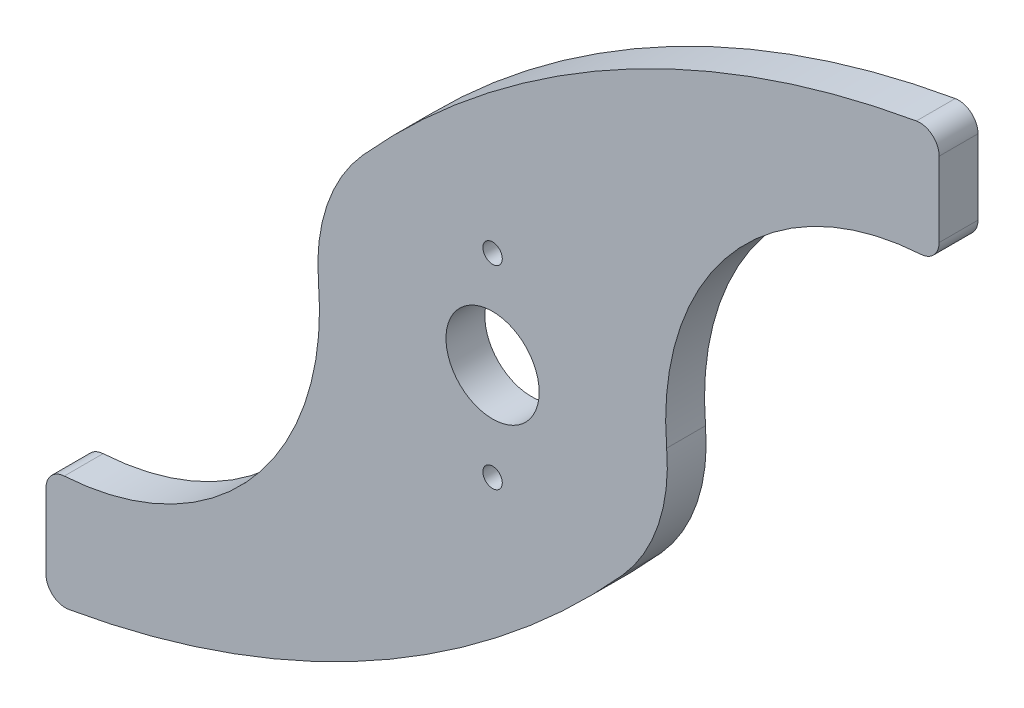
ISO-10303-21;
HEADER;
FILE_DESCRIPTION(('STEP AP214'),'2;1');
FILE_NAME('part.step','',(''),(''),'','','');
FILE_SCHEMA(('AUTOMOTIVE_DESIGN { 1 0 10303 214 1 1 1 1 }'));
ENDSEC;
DATA;
#1=APPLICATION_CONTEXT('core data for automotive mechanical design processes');
#2=APPLICATION_PROTOCOL_DEFINITION('international standard','automotive_design',2000,#1);
#3=PRODUCT_CONTEXT('',#1,'mechanical');
#4=PRODUCT('Part','Part','',(#3));
#5=PRODUCT_RELATED_PRODUCT_CATEGORY('part','',(#4));
#6=PRODUCT_DEFINITION_FORMATION('','',#4);
#7=PRODUCT_DEFINITION_CONTEXT('part definition',#1,'design');
#8=PRODUCT_DEFINITION('design','',#6,#7);
#9=PRODUCT_DEFINITION_SHAPE('','',#8);
#10=(LENGTH_UNIT() NAMED_UNIT(*) SI_UNIT(.MILLI.,.METRE.));
#11=(NAMED_UNIT(*) PLANE_ANGLE_UNIT() SI_UNIT($,.RADIAN.));
#12=(NAMED_UNIT(*) SI_UNIT($,.STERADIAN.) SOLID_ANGLE_UNIT());
#13=UNCERTAINTY_MEASURE_WITH_UNIT(LENGTH_MEASURE(1.E-05),#10,'distance_accuracy_value','');
#14=(GEOMETRIC_REPRESENTATION_CONTEXT(3) GLOBAL_UNCERTAINTY_ASSIGNED_CONTEXT((#13)) GLOBAL_UNIT_ASSIGNED_CONTEXT((#10,
#11,#12)) REPRESENTATION_CONTEXT('',''));
#15=CARTESIAN_POINT('',(0.,0.,0.));
#16=DIRECTION('',(0.,0.,1.));
#17=DIRECTION('',(1.,0.,0.));
#18=AXIS2_PLACEMENT_3D('',#15,#16,#17);
#19=CARTESIAN_POINT('',(0.,0.,10.));
#20=DIRECTION('',(0.,0.,-1.));
#21=DIRECTION('',(-1.,0.,0.));
#22=AXIS2_PLACEMENT_3D('',#19,#20,#21);
#23=CYLINDRICAL_SURFACE('',#22,45.);
#24=DIRECTION('',(0.,0.,1.));
#25=VECTOR('',#24,1.);
#26=CARTESIAN_POINT('',(33.436200173614,-30.1167813344989,0.));
#27=LINE('',#26,#25);
#28=CARTESIAN_POINT('',(33.436200173614,-30.1167813344989,0.));
#29=VERTEX_POINT('',#28);
#30=CARTESIAN_POINT('',(33.436200173614,-30.1167813344988,10.));
#31=VERTEX_POINT('',#30);
#32=EDGE_CURVE('E172',#29,#31,#27,.T.);
#33=ORIENTED_EDGE('',*,*,#32,.F.);
#34=CARTESIAN_POINT('',(0.,0.,0.));
#35=DIRECTION('',(0.,0.,1.));
#36=DIRECTION('',(1.,0.,0.));
#37=AXIS2_PLACEMENT_3D('',#34,#35,#36);
#38=CIRCLE('',#37,45.);
#39=CARTESIAN_POINT('',(44.8294985188369,3.91357414004155,0.));
#40=VERTEX_POINT('',#39);
#41=EDGE_CURVE('E157',#29,#40,#38,.T.);
#42=ORIENTED_EDGE('',*,*,#41,.T.);
#43=DIRECTION('',(0.,0.,1.));
#44=VECTOR('',#43,1.);
#45=CARTESIAN_POINT('',(44.8294985188369,3.91357414004155,0.));
#46=LINE('',#45,#44);
#47=CARTESIAN_POINT('',(44.8294985188369,3.91357414004155,10.));
#48=VERTEX_POINT('',#47);
#49=EDGE_CURVE('E204',#40,#48,#46,.T.);
#50=ORIENTED_EDGE('',*,*,#49,.T.);
#51=CARTESIAN_POINT('',(0.,0.,10.));
#52=DIRECTION('',(0.,0.,1.));
#53=DIRECTION('',(1.,0.,0.));
#54=AXIS2_PLACEMENT_3D('',#51,#52,#53);
#55=CIRCLE('',#54,45.);
#56=EDGE_CURVE('E174',#31,#48,#55,.T.);
#57=ORIENTED_EDGE('',*,*,#56,.F.);
#58=EDGE_LOOP('',(#33,#42,#50,#57));
#59=FACE_BOUND('',#58,.T.);
#60=ADVANCED_FACE('F69',(#59),#23,.T.);
#61=CARTESIAN_POINT('',(0.,0.,10.));
#62=DIRECTION('',(0.,0.,1.));
#63=DIRECTION('',(1.,0.,0.));
#64=AXIS2_PLACEMENT_3D('',#61,#62,#63);
#65=PLANE('',#64);
#66=CARTESIAN_POINT('',(0.,25.,10.));
#67=DIRECTION('',(0.,0.,1.));
#68=DIRECTION('',(1.,0.,0.));
#69=AXIS2_PLACEMENT_3D('',#66,#67,#68);
#70=CIRCLE('',#69,2.5);
#71=CARTESIAN_POINT('',(2.5,25.,10.));
#72=VERTEX_POINT('',#71);
#73=EDGE_CURVE('E298',#72,#72,#70,.T.);
#74=ORIENTED_EDGE('',*,*,#73,.F.);
#75=EDGE_LOOP('',(#74));
#76=FACE_BOUND('',#75,.T.);
#77=CARTESIAN_POINT('',(0.,-25.,10.));
#78=DIRECTION('',(0.,0.,1.));
#79=DIRECTION('',(1.,0.,0.));
#80=AXIS2_PLACEMENT_3D('',#77,#78,#79);
#81=CIRCLE('',#80,2.5);
#82=CARTESIAN_POINT('',(2.5,-25.,10.));
#83=VERTEX_POINT('',#82);
#84=EDGE_CURVE('E295',#83,#83,#81,.T.);
#85=ORIENTED_EDGE('',*,*,#84,.F.);
#86=EDGE_LOOP('',(#85));
#87=FACE_BOUND('',#86,.T.);
#88=DIRECTION('',(0.,1.,0.));
#89=VECTOR('',#88,1.);
#90=CARTESIAN_POINT('',(-115.,0.,10.));
#91=LINE('',#90,#89);
#92=CARTESIAN_POINT('',(-115.,-104.118502578652,10.));
#93=VERTEX_POINT('',#92);
#94=CARTESIAN_POINT('',(-115.,-84.8623433247219,10.));
#95=VERTEX_POINT('',#94);
#96=EDGE_CURVE('E191',#93,#95,#91,.T.);
#97=ORIENTED_EDGE('',*,*,#96,.F.);
#98=CARTESIAN_POINT('',(-110.,-104.118502578652,10.));
#99=DIRECTION('',(0.,0.,1.));
#100=DIRECTION('',(1.,0.,0.));
#101=AXIS2_PLACEMENT_3D('',#98,#99,#100);
#102=CIRCLE('',#101,5.);
#103=CARTESIAN_POINT('',(-109.136316990662,-109.04334284605,10.));
#104=VERTEX_POINT('',#103);
#105=EDGE_CURVE('E236',#93,#104,#102,.T.);
#106=ORIENTED_EDGE('',*,*,#105,.T.);
#107=CARTESIAN_POINT('',(-152.320467457575,137.198670523828,10.));
#108=DIRECTION('',(0.,0.,1.));
#109=DIRECTION('',(1.,0.,0.));
#110=AXIS2_PLACEMENT_3D('',#107,#108,#109);
#111=CIRCLE('',#110,250.);
#112=EDGE_CURVE('E195',#31,#104,#111,.F.);
#113=ORIENTED_EDGE('',*,*,#112,.F.);
#114=ORIENTED_EDGE('',*,*,#56,.T.);
#115=CARTESIAN_POINT('',(114.564273992583,10.0013561356617,10.));
#116=DIRECTION('',(0.,0.,1.));
#117=DIRECTION('',(1.,0.,0.));
#118=AXIS2_PLACEMENT_3D('',#115,#116,#117);
#119=CIRCLE('',#118,70.);
#120=CARTESIAN_POINT('',(110.304284932839,79.8716108454512,10.));
#121=VERTEX_POINT('',#120);
#122=EDGE_CURVE('E192',#121,#48,#119,.T.);
#123=ORIENTED_EDGE('',*,*,#122,.F.);
#124=CARTESIAN_POINT('',(110.,84.8623433247219,10.));
#125=DIRECTION('',(0.,0.,1.));
#126=DIRECTION('',(1.,0.,0.));
#127=AXIS2_PLACEMENT_3D('',#124,#125,#126);
#128=CIRCLE('',#127,5.);
#129=CARTESIAN_POINT('',(115.,84.8623433247219,10.));
#130=VERTEX_POINT('',#129);
#131=EDGE_CURVE('E232',#121,#130,#128,.T.);
#132=ORIENTED_EDGE('',*,*,#131,.T.);
#133=DIRECTION('',(0.,-1.,0.));
#134=VECTOR('',#133,1.);
#135=CARTESIAN_POINT('',(115.,0.,10.));
#136=LINE('',#135,#134);
#137=CARTESIAN_POINT('',(115.,104.118502578652,10.));
#138=VERTEX_POINT('',#137);
#139=EDGE_CURVE('E210',#138,#130,#136,.T.);
#140=ORIENTED_EDGE('',*,*,#139,.F.);
#141=CARTESIAN_POINT('',(110.,104.118502578652,10.));
#142=DIRECTION('',(0.,0.,1.));
#143=DIRECTION('',(1.,0.,0.));
#144=AXIS2_PLACEMENT_3D('',#141,#142,#143);
#145=CIRCLE('',#144,5.);
#146=CARTESIAN_POINT('',(109.136316990662,109.04334284605,10.));
#147=VERTEX_POINT('',#146);
#148=EDGE_CURVE('E230',#138,#147,#145,.T.);
#149=ORIENTED_EDGE('',*,*,#148,.T.);
#150=CARTESIAN_POINT('',(152.320467457575,-137.198670523828,10.));
#151=DIRECTION('',(0.,0.,1.));
#152=DIRECTION('',(1.,0.,0.));
#153=AXIS2_PLACEMENT_3D('',#150,#151,#152);
#154=CIRCLE('',#153,250.);
#155=CARTESIAN_POINT('',(-33.436200173614,30.1167813344988,10.));
#156=VERTEX_POINT('',#155);
#157=EDGE_CURVE('E207',#156,#147,#154,.F.);
#158=ORIENTED_EDGE('',*,*,#157,.F.);
#159=CARTESIAN_POINT('',(-44.8294985188369,-3.91357414004156,10.));
#160=VERTEX_POINT('',#159);
#161=EDGE_CURVE('E223',#156,#160,#55,.T.);
#162=ORIENTED_EDGE('',*,*,#161,.T.);
#163=CARTESIAN_POINT('',(-114.564273992583,-10.0013561356617,10.));
#164=DIRECTION('',(0.,0.,1.));
#165=DIRECTION('',(1.,0.,0.));
#166=AXIS2_PLACEMENT_3D('',#163,#164,#165);
#167=CIRCLE('',#166,70.);
#168=CARTESIAN_POINT('',(-110.304284932839,-79.8716108454512,10.));
#169=VERTEX_POINT('',#168);
#170=EDGE_CURVE('E189',#169,#160,#167,.T.);
#171=ORIENTED_EDGE('',*,*,#170,.F.);
#172=CARTESIAN_POINT('',(-110.,-84.8623433247219,10.));
#173=DIRECTION('',(0.,0.,1.));
#174=DIRECTION('',(1.,0.,0.));
#175=AXIS2_PLACEMENT_3D('',#172,#173,#174);
#176=CIRCLE('',#175,5.);
#177=EDGE_CURVE('E234',#169,#95,#176,.T.);
#178=ORIENTED_EDGE('',*,*,#177,.T.);
#179=EDGE_LOOP('',(#97,#106,#113,#114,#123,#132,#140,#149,#158,#162,#171,#178));
#180=FACE_BOUND('',#179,.T.);
#181=CARTESIAN_POINT('',(0.,0.,10.));
#182=DIRECTION('',(0.,0.,1.));
#183=DIRECTION('',(1.,0.,0.));
#184=AXIS2_PLACEMENT_3D('',#181,#182,#183);
#185=CIRCLE('',#184,12.);
#186=CARTESIAN_POINT('',(12.,0.,10.));
#187=VERTEX_POINT('',#186);
#188=EDGE_CURVE('E169',#187,#187,#185,.T.);
#189=ORIENTED_EDGE('',*,*,#188,.F.);
#190=EDGE_LOOP('',(#189));
#191=FACE_BOUND('',#190,.T.);
#192=ADVANCED_FACE('F268',(#76,#87,#180,#191),#65,.T.);
#193=CARTESIAN_POINT('',(0.,0.,0.));
#194=DIRECTION('',(0.,0.,1.));
#195=DIRECTION('',(1.,0.,0.));
#196=AXIS2_PLACEMENT_3D('',#193,#194,#195);
#197=PLANE('',#196);
#198=CARTESIAN_POINT('',(0.,25.,0.));
#199=DIRECTION('',(0.,0.,1.));
#200=DIRECTION('',(1.,0.,0.));
#201=AXIS2_PLACEMENT_3D('',#198,#199,#200);
#202=CIRCLE('',#201,2.5);
#203=CARTESIAN_POINT('',(2.5,25.,0.));
#204=VERTEX_POINT('',#203);
#205=EDGE_CURVE('E206',#204,#204,#202,.T.);
#206=ORIENTED_EDGE('',*,*,#205,.T.);
#207=EDGE_LOOP('',(#206));
#208=FACE_BOUND('',#207,.T.);
#209=CARTESIAN_POINT('',(0.,-25.,0.));
#210=DIRECTION('',(0.,0.,1.));
#211=DIRECTION('',(1.,0.,0.));
#212=AXIS2_PLACEMENT_3D('',#209,#210,#211);
#213=CIRCLE('',#212,2.5);
#214=CARTESIAN_POINT('',(2.5,-25.,0.));
#215=VERTEX_POINT('',#214);
#216=EDGE_CURVE('E292',#215,#215,#213,.T.);
#217=ORIENTED_EDGE('',*,*,#216,.T.);
#218=EDGE_LOOP('',(#217));
#219=FACE_BOUND('',#218,.T.);
#220=CARTESIAN_POINT('',(-152.320467457575,137.198670523828,0.));
#221=DIRECTION('',(0.,0.,1.));
#222=DIRECTION('',(1.,0.,0.));
#223=AXIS2_PLACEMENT_3D('',#220,#221,#222);
#224=CIRCLE('',#223,250.);
#225=CARTESIAN_POINT('',(-109.136316990662,-109.04334284605,0.));
#226=VERTEX_POINT('',#225);
#227=EDGE_CURVE('E162',#29,#226,#224,.F.);
#228=ORIENTED_EDGE('',*,*,#227,.T.);
#229=CARTESIAN_POINT('',(-110.,-104.118502578652,0.));
#230=DIRECTION('',(0.,0.,1.));
#231=DIRECTION('',(1.,0.,0.));
#232=AXIS2_PLACEMENT_3D('',#229,#230,#231);
#233=CIRCLE('',#232,5.);
#234=CARTESIAN_POINT('',(-115.,-104.118502578652,0.));
#235=VERTEX_POINT('',#234);
#236=EDGE_CURVE('E243',#226,#235,#233,.F.);
#237=ORIENTED_EDGE('',*,*,#236,.T.);
#238=DIRECTION('',(0.,1.,0.));
#239=VECTOR('',#238,1.);
#240=CARTESIAN_POINT('',(-115.,0.,0.));
#241=LINE('',#240,#239);
#242=CARTESIAN_POINT('',(-115.,-84.8623433247219,0.));
#243=VERTEX_POINT('',#242);
#244=EDGE_CURVE('E183',#235,#243,#241,.T.);
#245=ORIENTED_EDGE('',*,*,#244,.T.);
#246=CARTESIAN_POINT('',(-110.,-84.8623433247219,0.));
#247=DIRECTION('',(0.,0.,1.));
#248=DIRECTION('',(1.,0.,0.));
#249=AXIS2_PLACEMENT_3D('',#246,#247,#248);
#250=CIRCLE('',#249,5.);
#251=CARTESIAN_POINT('',(-110.304284932839,-79.8716108454512,0.));
#252=VERTEX_POINT('',#251);
#253=EDGE_CURVE('E84',#243,#252,#250,.F.);
#254=ORIENTED_EDGE('',*,*,#253,.T.);
#255=CARTESIAN_POINT('',(-114.564273992583,-10.0013561356617,0.));
#256=DIRECTION('',(0.,0.,1.));
#257=DIRECTION('',(1.,0.,0.));
#258=AXIS2_PLACEMENT_3D('',#255,#256,#257);
#259=CIRCLE('',#258,70.);
#260=CARTESIAN_POINT('',(-44.8294985188369,-3.91357414004155,0.));
#261=VERTEX_POINT('',#260);
#262=EDGE_CURVE('E185',#252,#261,#259,.T.);
#263=ORIENTED_EDGE('',*,*,#262,.T.);
#264=CARTESIAN_POINT('',(-33.436200173614,30.1167813344989,0.));
#265=VERTEX_POINT('',#264);
#266=EDGE_CURVE('E168',#265,#261,#38,.T.);
#267=ORIENTED_EDGE('',*,*,#266,.F.);
#268=CARTESIAN_POINT('',(152.320467457575,-137.198670523828,0.));
#269=DIRECTION('',(0.,0.,1.));
#270=DIRECTION('',(1.,0.,0.));
#271=AXIS2_PLACEMENT_3D('',#268,#269,#270);
#272=CIRCLE('',#271,250.);
#273=CARTESIAN_POINT('',(109.136316990662,109.04334284605,0.));
#274=VERTEX_POINT('',#273);
#275=EDGE_CURVE('E203',#265,#274,#272,.F.);
#276=ORIENTED_EDGE('',*,*,#275,.T.);
#277=CARTESIAN_POINT('',(110.,104.118502578652,0.));
#278=DIRECTION('',(0.,0.,1.));
#279=DIRECTION('',(1.,0.,0.));
#280=AXIS2_PLACEMENT_3D('',#277,#278,#279);
#281=CIRCLE('',#280,5.);
#282=CARTESIAN_POINT('',(115.,104.118502578652,0.));
#283=VERTEX_POINT('',#282);
#284=EDGE_CURVE('E239',#274,#283,#281,.F.);
#285=ORIENTED_EDGE('',*,*,#284,.T.);
#286=DIRECTION('',(0.,-1.,0.));
#287=VECTOR('',#286,1.);
#288=CARTESIAN_POINT('',(115.,0.,0.));
#289=LINE('',#288,#287);
#290=CARTESIAN_POINT('',(115.,84.8623433247219,0.));
#291=VERTEX_POINT('',#290);
#292=EDGE_CURVE('E216',#283,#291,#289,.T.);
#293=ORIENTED_EDGE('',*,*,#292,.T.);
#294=CARTESIAN_POINT('',(110.,84.8623433247219,0.));
#295=DIRECTION('',(0.,0.,1.));
#296=DIRECTION('',(1.,0.,0.));
#297=AXIS2_PLACEMENT_3D('',#294,#295,#296);
#298=CIRCLE('',#297,5.);
#299=CARTESIAN_POINT('',(110.304284932839,79.8716108454512,0.));
#300=VERTEX_POINT('',#299);
#301=EDGE_CURVE('E91',#291,#300,#298,.F.);
#302=ORIENTED_EDGE('',*,*,#301,.T.);
#303=CARTESIAN_POINT('',(114.564273992583,10.0013561356617,0.));
#304=DIRECTION('',(0.,0.,1.));
#305=DIRECTION('',(1.,0.,0.));
#306=AXIS2_PLACEMENT_3D('',#303,#304,#305);
#307=CIRCLE('',#306,70.);
#308=EDGE_CURVE('E164',#300,#40,#307,.T.);
#309=ORIENTED_EDGE('',*,*,#308,.T.);
#310=ORIENTED_EDGE('',*,*,#41,.F.);
#311=EDGE_LOOP('',(#228,#237,#245,#254,#263,#267,#276,#285,#293,#302,#309,#310));
#312=FACE_BOUND('',#311,.T.);
#313=CARTESIAN_POINT('',(0.,0.,0.));
#314=DIRECTION('',(0.,0.,1.));
#315=DIRECTION('',(1.,0.,0.));
#316=AXIS2_PLACEMENT_3D('',#313,#314,#315);
#317=CIRCLE('',#316,12.);
#318=CARTESIAN_POINT('',(12.,0.,0.));
#319=VERTEX_POINT('',#318);
#320=EDGE_CURVE('E198',#319,#319,#317,.T.);
#321=ORIENTED_EDGE('',*,*,#320,.T.);
#322=EDGE_LOOP('',(#321));
#323=FACE_BOUND('',#322,.T.);
#324=ADVANCED_FACE('F159',(#208,#219,#312,#323),#197,.F.);
#325=ORIENTED_EDGE('',*,*,#266,.T.);
#326=DIRECTION('',(0.,0.,1.));
#327=VECTOR('',#326,1.);
#328=CARTESIAN_POINT('',(-44.8294985188369,-3.91357414004155,0.));
#329=LINE('',#328,#327);
#330=EDGE_CURVE('E178',#261,#160,#329,.T.);
#331=ORIENTED_EDGE('',*,*,#330,.T.);
#332=ORIENTED_EDGE('',*,*,#161,.F.);
#333=DIRECTION('',(0.,0.,1.));
#334=VECTOR('',#333,1.);
#335=CARTESIAN_POINT('',(-33.436200173614,30.1167813344989,0.));
#336=LINE('',#335,#334);
#337=EDGE_CURVE('E200',#265,#156,#336,.T.);
#338=ORIENTED_EDGE('',*,*,#337,.F.);
#339=EDGE_LOOP('',(#325,#331,#332,#338));
#340=FACE_BOUND('',#339,.T.);
#341=ADVANCED_FACE('F289',(#340),#23,.T.);
#342=CARTESIAN_POINT('',(0.,0.,10.));
#343=DIRECTION('',(0.,0.,-1.));
#344=DIRECTION('',(-1.,0.,0.));
#345=AXIS2_PLACEMENT_3D('',#342,#343,#344);
#346=CYLINDRICAL_SURFACE('',#345,12.);
#347=ORIENTED_EDGE('',*,*,#188,.T.);
#348=EDGE_LOOP('',(#347));
#349=FACE_BOUND('',#348,.T.);
#350=ORIENTED_EDGE('',*,*,#320,.F.);
#351=EDGE_LOOP('',(#350));
#352=FACE_BOUND('',#351,.T.);
#353=ADVANCED_FACE('F336',(#349,#352),#346,.F.);
#354=CARTESIAN_POINT('',(114.564273992583,10.0013561356617,0.));
#355=DIRECTION('',(0.,0.,1.));
#356=DIRECTION('',(1.,0.,0.));
#357=AXIS2_PLACEMENT_3D('',#354,#355,#356);
#358=CYLINDRICAL_SURFACE('',#357,70.);
#359=ORIENTED_EDGE('',*,*,#308,.F.);
#360=DIRECTION('',(0.,0.,1.));
#361=VECTOR('',#360,1.);
#362=CARTESIAN_POINT('',(110.304284932839,79.8716108454512,0.));
#363=LINE('',#362,#361);
#364=EDGE_CURVE('E248',#300,#121,#363,.T.);
#365=ORIENTED_EDGE('',*,*,#364,.T.);
#366=ORIENTED_EDGE('',*,*,#122,.T.);
#367=ORIENTED_EDGE('',*,*,#49,.F.);
#368=EDGE_LOOP('',(#359,#365,#366,#367));
#369=FACE_BOUND('',#368,.T.);
#370=ADVANCED_FACE('F265',(#369),#358,.F.);
#371=CARTESIAN_POINT('',(152.320467457575,-137.198670523828,0.));
#372=DIRECTION('',(0.,0.,1.));
#373=DIRECTION('',(1.,0.,0.));
#374=AXIS2_PLACEMENT_3D('',#371,#372,#373);
#375=CYLINDRICAL_SURFACE('',#374,250.);
#376=ORIENTED_EDGE('',*,*,#157,.T.);
#377=DIRECTION('',(0.,0.,1.));
#378=VECTOR('',#377,1.);
#379=CARTESIAN_POINT('',(109.136316990662,109.04334284605,0.));
#380=LINE('',#379,#378);
#381=EDGE_CURVE('E12',#147,#274,#380,.F.);
#382=ORIENTED_EDGE('',*,*,#381,.T.);
#383=ORIENTED_EDGE('',*,*,#275,.F.);
#384=ORIENTED_EDGE('',*,*,#337,.T.);
#385=EDGE_LOOP('',(#376,#382,#383,#384));
#386=FACE_BOUND('',#385,.T.);
#387=ADVANCED_FACE('F345',(#386),#375,.T.);
#388=CARTESIAN_POINT('',(115.,0.,0.));
#389=DIRECTION('',(-1.,0.,0.));
#390=DIRECTION('',(0.,0.,1.));
#391=AXIS2_PLACEMENT_3D('',#388,#389,#390);
#392=PLANE('',#391);
#393=ORIENTED_EDGE('',*,*,#139,.T.);
#394=DIRECTION('',(0.,0.,1.));
#395=VECTOR('',#394,1.);
#396=CARTESIAN_POINT('',(115.,84.8623433247219,0.));
#397=LINE('',#396,#395);
#398=EDGE_CURVE('E77',#130,#291,#397,.F.);
#399=ORIENTED_EDGE('',*,*,#398,.T.);
#400=ORIENTED_EDGE('',*,*,#292,.F.);
#401=DIRECTION('',(0.,0.,1.));
#402=VECTOR('',#401,1.);
#403=CARTESIAN_POINT('',(115.,104.118502578652,0.));
#404=LINE('',#403,#402);
#405=EDGE_CURVE('E251',#283,#138,#404,.T.);
#406=ORIENTED_EDGE('',*,*,#405,.T.);
#407=EDGE_LOOP('',(#393,#399,#400,#406));
#408=FACE_BOUND('',#407,.T.);
#409=ADVANCED_FACE('F256',(#408),#392,.F.);
#410=CARTESIAN_POINT('',(-152.320467457575,137.198670523828,0.));
#411=DIRECTION('',(0.,0.,1.));
#412=DIRECTION('',(1.,0.,0.));
#413=AXIS2_PLACEMENT_3D('',#410,#411,#412);
#414=CYLINDRICAL_SURFACE('',#413,250.);
#415=ORIENTED_EDGE('',*,*,#112,.T.);
#416=DIRECTION('',(0.,0.,1.));
#417=VECTOR('',#416,1.);
#418=CARTESIAN_POINT('',(-109.136316990662,-109.04334284605,0.));
#419=LINE('',#418,#417);
#420=EDGE_CURVE('E182',#104,#226,#419,.F.);
#421=ORIENTED_EDGE('',*,*,#420,.T.);
#422=ORIENTED_EDGE('',*,*,#227,.F.);
#423=ORIENTED_EDGE('',*,*,#32,.T.);
#424=EDGE_LOOP('',(#415,#421,#422,#423));
#425=FACE_BOUND('',#424,.T.);
#426=ADVANCED_FACE('F180',(#425),#414,.T.);
#427=CARTESIAN_POINT('',(-115.,0.,0.));
#428=DIRECTION('',(1.,0.,0.));
#429=DIRECTION('',(0.,1.,0.));
#430=AXIS2_PLACEMENT_3D('',#427,#428,#429);
#431=PLANE('',#430);
#432=ORIENTED_EDGE('',*,*,#244,.F.);
#433=DIRECTION('',(0.,0.,1.));
#434=VECTOR('',#433,1.);
#435=CARTESIAN_POINT('',(-115.,-104.118502578652,0.));
#436=LINE('',#435,#434);
#437=EDGE_CURVE('E227',#235,#93,#436,.T.);
#438=ORIENTED_EDGE('',*,*,#437,.T.);
#439=ORIENTED_EDGE('',*,*,#96,.T.);
#440=DIRECTION('',(0.,0.,1.));
#441=VECTOR('',#440,1.);
#442=CARTESIAN_POINT('',(-115.,-84.8623433247219,0.));
#443=LINE('',#442,#441);
#444=EDGE_CURVE('E225',#95,#243,#443,.F.);
#445=ORIENTED_EDGE('',*,*,#444,.T.);
#446=EDGE_LOOP('',(#432,#438,#439,#445));
#447=FACE_BOUND('',#446,.T.);
#448=ADVANCED_FACE('F275',(#447),#431,.F.);
#449=CARTESIAN_POINT('',(-114.564273992583,-10.0013561356617,0.));
#450=DIRECTION('',(0.,0.,1.));
#451=DIRECTION('',(1.,0.,0.));
#452=AXIS2_PLACEMENT_3D('',#449,#450,#451);
#453=CYLINDRICAL_SURFACE('',#452,70.);
#454=ORIENTED_EDGE('',*,*,#262,.F.);
#455=DIRECTION('',(0.,0.,1.));
#456=VECTOR('',#455,1.);
#457=CARTESIAN_POINT('',(-110.304284932839,-79.8716108454512,0.));
#458=LINE('',#457,#456);
#459=EDGE_CURVE('E245',#252,#169,#458,.T.);
#460=ORIENTED_EDGE('',*,*,#459,.T.);
#461=ORIENTED_EDGE('',*,*,#170,.T.);
#462=ORIENTED_EDGE('',*,*,#330,.F.);
#463=EDGE_LOOP('',(#454,#460,#461,#462));
#464=FACE_BOUND('',#463,.T.);
#465=ADVANCED_FACE('F282',(#464),#453,.F.);
#466=CARTESIAN_POINT('',(-110.,-104.118502578652,0.));
#467=DIRECTION('',(0.,0.,1.));
#468=DIRECTION('',(1.,0.,0.));
#469=AXIS2_PLACEMENT_3D('',#466,#467,#468);
#470=CYLINDRICAL_SURFACE('',#469,5.);
#471=ORIENTED_EDGE('',*,*,#236,.F.);
#472=ORIENTED_EDGE('',*,*,#420,.F.);
#473=ORIENTED_EDGE('',*,*,#105,.F.);
#474=ORIENTED_EDGE('',*,*,#437,.F.);
#475=EDGE_LOOP('',(#471,#472,#473,#474));
#476=FACE_BOUND('',#475,.T.);
#477=ADVANCED_FACE('F271',(#476),#470,.T.);
#478=CARTESIAN_POINT('',(-110.,-84.8623433247219,0.));
#479=DIRECTION('',(0.,0.,1.));
#480=DIRECTION('',(1.,0.,0.));
#481=AXIS2_PLACEMENT_3D('',#478,#479,#480);
#482=CYLINDRICAL_SURFACE('',#481,5.);
#483=ORIENTED_EDGE('',*,*,#253,.F.);
#484=ORIENTED_EDGE('',*,*,#444,.F.);
#485=ORIENTED_EDGE('',*,*,#177,.F.);
#486=ORIENTED_EDGE('',*,*,#459,.F.);
#487=EDGE_LOOP('',(#483,#484,#485,#486));
#488=FACE_BOUND('',#487,.T.);
#489=ADVANCED_FACE('F278',(#488),#482,.T.);
#490=CARTESIAN_POINT('',(110.,84.8623433247219,0.));
#491=DIRECTION('',(0.,0.,1.));
#492=DIRECTION('',(1.,0.,0.));
#493=AXIS2_PLACEMENT_3D('',#490,#491,#492);
#494=CYLINDRICAL_SURFACE('',#493,5.);
#495=ORIENTED_EDGE('',*,*,#301,.F.);
#496=ORIENTED_EDGE('',*,*,#398,.F.);
#497=ORIENTED_EDGE('',*,*,#131,.F.);
#498=ORIENTED_EDGE('',*,*,#364,.F.);
#499=EDGE_LOOP('',(#495,#496,#497,#498));
#500=FACE_BOUND('',#499,.T.);
#501=ADVANCED_FACE('F262',(#500),#494,.T.);
#502=CARTESIAN_POINT('',(110.,104.118502578652,0.));
#503=DIRECTION('',(0.,0.,1.));
#504=DIRECTION('',(1.,0.,0.));
#505=AXIS2_PLACEMENT_3D('',#502,#503,#504);
#506=CYLINDRICAL_SURFACE('',#505,5.);
#507=ORIENTED_EDGE('',*,*,#284,.F.);
#508=ORIENTED_EDGE('',*,*,#381,.F.);
#509=ORIENTED_EDGE('',*,*,#148,.F.);
#510=ORIENTED_EDGE('',*,*,#405,.F.);
#511=EDGE_LOOP('',(#507,#508,#509,#510));
#512=FACE_BOUND('',#511,.T.);
#513=ADVANCED_FACE('F71',(#512),#506,.T.);
#514=CARTESIAN_POINT('',(0.,-25.,0.));
#515=DIRECTION('',(0.,0.,1.));
#516=DIRECTION('',(1.,0.,0.));
#517=AXIS2_PLACEMENT_3D('',#514,#515,#516);
#518=CYLINDRICAL_SURFACE('',#517,2.5);
#519=ORIENTED_EDGE('',*,*,#216,.F.);
#520=EDGE_LOOP('',(#519));
#521=FACE_BOUND('',#520,.T.);
#522=ORIENTED_EDGE('',*,*,#84,.T.);
#523=EDGE_LOOP('',(#522));
#524=FACE_BOUND('',#523,.T.);
#525=ADVANCED_FACE('F309',(#521,#524),#518,.F.);
#526=CARTESIAN_POINT('',(0.,25.,0.));
#527=DIRECTION('',(0.,0.,1.));
#528=DIRECTION('',(1.,0.,0.));
#529=AXIS2_PLACEMENT_3D('',#526,#527,#528);
#530=CYLINDRICAL_SURFACE('',#529,2.5);
#531=ORIENTED_EDGE('',*,*,#205,.F.);
#532=EDGE_LOOP('',(#531));
#533=FACE_BOUND('',#532,.T.);
#534=ORIENTED_EDGE('',*,*,#73,.T.);
#535=EDGE_LOOP('',(#534));
#536=FACE_BOUND('',#535,.T.);
#537=ADVANCED_FACE('F306',(#533,#536),#530,.F.);
#538=CLOSED_SHELL('',(#60,#192,#324,#341,#353,#370,#387,#409,#426,#448,#465,#477,#489,#501,#513,
#525,#537));
#539=MANIFOLD_SOLID_BREP('B2',#538);
#540=ADVANCED_BREP_SHAPE_REPRESENTATION('',(#18,#539),#14);
#541=SHAPE_DEFINITION_REPRESENTATION(#9,#540);
ENDSEC;
END-ISO-10303-21;
